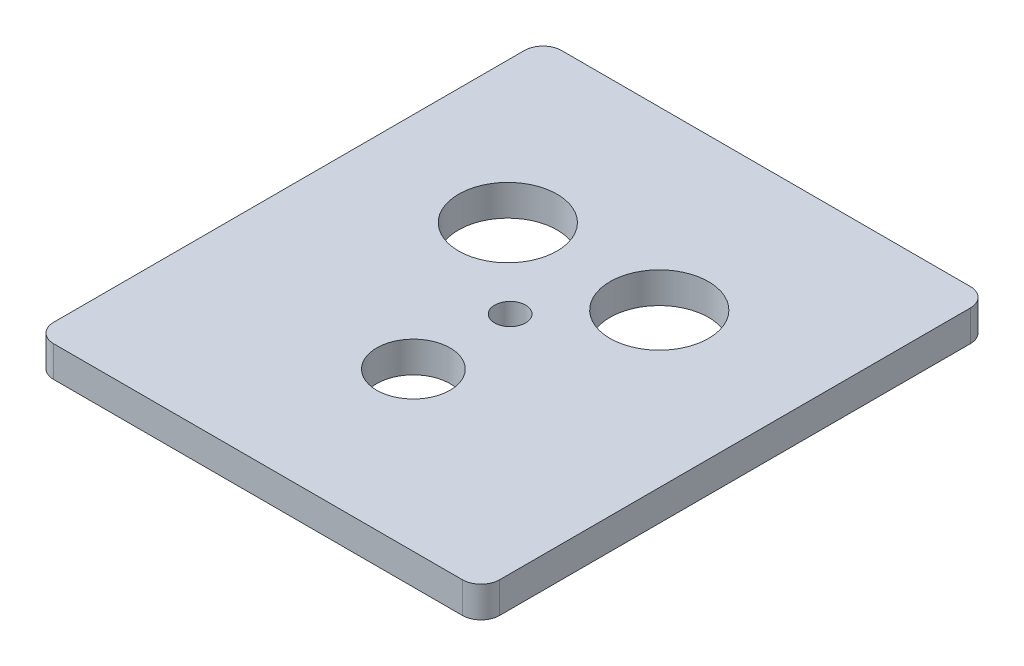
ISO-10303-21;
HEADER;
FILE_DESCRIPTION(('STEP AP214'),'2;1');
FILE_NAME('part.step','',(''),(''),'','','');
FILE_SCHEMA(('AUTOMOTIVE_DESIGN { 1 0 10303 214 1 1 1 1 }'));
ENDSEC;
DATA;
#1=APPLICATION_CONTEXT('core data for automotive mechanical design processes');
#2=APPLICATION_PROTOCOL_DEFINITION('international standard','automotive_design',2000,#1);
#3=PRODUCT_CONTEXT('',#1,'mechanical');
#4=PRODUCT('Part','Part','',(#3));
#5=PRODUCT_RELATED_PRODUCT_CATEGORY('part','',(#4));
#6=PRODUCT_DEFINITION_FORMATION('','',#4);
#7=PRODUCT_DEFINITION_CONTEXT('part definition',#1,'design');
#8=PRODUCT_DEFINITION('design','',#6,#7);
#9=PRODUCT_DEFINITION_SHAPE('','',#8);
#10=(LENGTH_UNIT() NAMED_UNIT(*) SI_UNIT(.MILLI.,.METRE.));
#11=(NAMED_UNIT(*) PLANE_ANGLE_UNIT() SI_UNIT($,.RADIAN.));
#12=(NAMED_UNIT(*) SI_UNIT($,.STERADIAN.) SOLID_ANGLE_UNIT());
#13=UNCERTAINTY_MEASURE_WITH_UNIT(LENGTH_MEASURE(1.E-05),#10,'distance_accuracy_value','');
#14=(GEOMETRIC_REPRESENTATION_CONTEXT(3) GLOBAL_UNCERTAINTY_ASSIGNED_CONTEXT((#13)) GLOBAL_UNIT_ASSIGNED_CONTEXT((#10,
#11,#12)) REPRESENTATION_CONTEXT('',''));
#15=CARTESIAN_POINT('',(0.,0.,0.));
#16=DIRECTION('',(0.,0.,1.));
#17=DIRECTION('',(1.,0.,0.));
#18=AXIS2_PLACEMENT_3D('',#15,#16,#17);
#19=CARTESIAN_POINT('',(-34.7211155378486,5.,50.601593625498));
#20=DIRECTION('',(0.,-1.,0.));
#21=DIRECTION('',(0.,0.,-1.));
#22=AXIS2_PLACEMENT_3D('',#19,#20,#21);
#23=CYLINDRICAL_SURFACE('',#22,3.);
#24=CARTESIAN_POINT('',(-34.7211155378486,0.,50.601593625498));
#25=DIRECTION('',(0.,1.,0.));
#26=DIRECTION('',(0.,0.,1.));
#27=AXIS2_PLACEMENT_3D('',#24,#25,#26);
#28=CIRCLE('',#27,3.);
#29=CARTESIAN_POINT('',(-37.7211155378486,0.,50.601593625498));
#30=VERTEX_POINT('',#29);
#31=CARTESIAN_POINT('',(-34.7211155378486,0.,53.601593625498));
#32=VERTEX_POINT('',#31);
#33=EDGE_CURVE('E135',#30,#32,#28,.T.);
#34=ORIENTED_EDGE('',*,*,#33,.T.);
#35=DIRECTION('',(0.,-1.,0.));
#36=VECTOR('',#35,1.);
#37=CARTESIAN_POINT('',(-34.7211155378486,5.,53.601593625498));
#38=LINE('',#37,#36);
#39=CARTESIAN_POINT('',(-34.7211155378486,5.,53.601593625498));
#40=VERTEX_POINT('',#39);
#41=EDGE_CURVE('E11',#40,#32,#38,.T.);
#42=ORIENTED_EDGE('',*,*,#41,.F.);
#43=CARTESIAN_POINT('',(-34.7211155378486,5.,50.601593625498));
#44=DIRECTION('',(0.,1.,0.));
#45=DIRECTION('',(0.,0.,1.));
#46=AXIS2_PLACEMENT_3D('',#43,#44,#45);
#47=CIRCLE('',#46,3.);
#48=CARTESIAN_POINT('',(-37.7211155378486,5.,50.601593625498));
#49=VERTEX_POINT('',#48);
#50=EDGE_CURVE('E150',#49,#40,#47,.T.);
#51=ORIENTED_EDGE('',*,*,#50,.F.);
#52=DIRECTION('',(0.,-1.,0.));
#53=VECTOR('',#52,1.);
#54=CARTESIAN_POINT('',(-37.7211155378486,5.,50.601593625498));
#55=LINE('',#54,#53);
#56=EDGE_CURVE('E131',#49,#30,#55,.T.);
#57=ORIENTED_EDGE('',*,*,#56,.T.);
#58=EDGE_LOOP('',(#34,#42,#51,#57));
#59=FACE_BOUND('',#58,.T.);
#60=ADVANCED_FACE('F39',(#59),#23,.T.);
#61=CARTESIAN_POINT('',(-34.7211155378486,5.,53.601593625498));
#62=DIRECTION('',(0.,0.,-1.));
#63=DIRECTION('',(-1.,0.,0.));
#64=AXIS2_PLACEMENT_3D('',#61,#62,#63);
#65=PLANE('',#64);
#66=DIRECTION('',(1.,0.,0.));
#67=VECTOR('',#66,1.);
#68=CARTESIAN_POINT('',(-34.7211155378486,0.,53.601593625498));
#69=LINE('',#68,#67);
#70=CARTESIAN_POINT('',(31.2788844621514,0.,53.601593625498));
#71=VERTEX_POINT('',#70);
#72=EDGE_CURVE('E138',#32,#71,#69,.T.);
#73=ORIENTED_EDGE('',*,*,#72,.T.);
#74=DIRECTION('',(0.,-1.,0.));
#75=VECTOR('',#74,1.);
#76=CARTESIAN_POINT('',(31.2788844621514,5.,53.601593625498));
#77=LINE('',#76,#75);
#78=CARTESIAN_POINT('',(31.2788844621514,5.,53.601593625498));
#79=VERTEX_POINT('',#78);
#80=EDGE_CURVE('E47',#79,#71,#77,.T.);
#81=ORIENTED_EDGE('',*,*,#80,.F.);
#82=DIRECTION('',(1.,0.,0.));
#83=VECTOR('',#82,1.);
#84=CARTESIAN_POINT('',(-34.7211155378486,5.,53.601593625498));
#85=LINE('',#84,#83);
#86=EDGE_CURVE('E98',#40,#79,#85,.T.);
#87=ORIENTED_EDGE('',*,*,#86,.F.);
#88=ORIENTED_EDGE('',*,*,#41,.T.);
#89=EDGE_LOOP('',(#73,#81,#87,#88));
#90=FACE_BOUND('',#89,.T.);
#91=ADVANCED_FACE('F240',(#90),#65,.F.);
#92=CARTESIAN_POINT('',(31.2788844621514,5.,50.601593625498));
#93=DIRECTION('',(0.,-1.,0.));
#94=DIRECTION('',(0.,0.,-1.));
#95=AXIS2_PLACEMENT_3D('',#92,#93,#94);
#96=CYLINDRICAL_SURFACE('',#95,3.);
#97=CARTESIAN_POINT('',(31.2788844621514,0.,50.601593625498));
#98=DIRECTION('',(0.,1.,0.));
#99=DIRECTION('',(0.,0.,1.));
#100=AXIS2_PLACEMENT_3D('',#97,#98,#99);
#101=CIRCLE('',#100,3.);
#102=CARTESIAN_POINT('',(34.2788844621514,0.,50.601593625498));
#103=VERTEX_POINT('',#102);
#104=EDGE_CURVE('E141',#71,#103,#101,.T.);
#105=ORIENTED_EDGE('',*,*,#104,.T.);
#106=DIRECTION('',(0.,-1.,0.));
#107=VECTOR('',#106,1.);
#108=CARTESIAN_POINT('',(34.2788844621514,5.,50.601593625498));
#109=LINE('',#108,#107);
#110=CARTESIAN_POINT('',(34.2788844621514,5.,50.601593625498));
#111=VERTEX_POINT('',#110);
#112=EDGE_CURVE('E157',#111,#103,#109,.T.);
#113=ORIENTED_EDGE('',*,*,#112,.F.);
#114=CARTESIAN_POINT('',(31.2788844621514,5.,50.601593625498));
#115=DIRECTION('',(0.,1.,0.));
#116=DIRECTION('',(0.,0.,1.));
#117=AXIS2_PLACEMENT_3D('',#114,#115,#116);
#118=CIRCLE('',#117,3.);
#119=EDGE_CURVE('E165',#79,#111,#118,.T.);
#120=ORIENTED_EDGE('',*,*,#119,.F.);
#121=ORIENTED_EDGE('',*,*,#80,.T.);
#122=EDGE_LOOP('',(#105,#113,#120,#121));
#123=FACE_BOUND('',#122,.T.);
#124=ADVANCED_FACE('F163',(#123),#96,.T.);
#125=CARTESIAN_POINT('',(34.2788844621514,5.,-25.398406374502));
#126=DIRECTION('',(-1.,0.,0.));
#127=DIRECTION('',(0.,0.,1.));
#128=AXIS2_PLACEMENT_3D('',#125,#126,#127);
#129=PLANE('',#128);
#130=DIRECTION('',(0.,0.,-1.));
#131=VECTOR('',#130,1.);
#132=CARTESIAN_POINT('',(34.2788844621514,0.,-25.398406374502));
#133=LINE('',#132,#131);
#134=CARTESIAN_POINT('',(34.2788844621514,0.,-25.398406374502));
#135=VERTEX_POINT('',#134);
#136=EDGE_CURVE('E143',#103,#135,#133,.T.);
#137=ORIENTED_EDGE('',*,*,#136,.T.);
#138=DIRECTION('',(0.,-1.,0.));
#139=VECTOR('',#138,1.);
#140=CARTESIAN_POINT('',(34.2788844621514,5.,-25.398406374502));
#141=LINE('',#140,#139);
#142=CARTESIAN_POINT('',(34.2788844621514,5.,-25.398406374502));
#143=VERTEX_POINT('',#142);
#144=EDGE_CURVE('E154',#143,#135,#141,.T.);
#145=ORIENTED_EDGE('',*,*,#144,.F.);
#146=DIRECTION('',(0.,0.,-1.));
#147=VECTOR('',#146,1.);
#148=CARTESIAN_POINT('',(34.2788844621514,5.,-25.398406374502));
#149=LINE('',#148,#147);
#150=EDGE_CURVE('E177',#111,#143,#149,.T.);
#151=ORIENTED_EDGE('',*,*,#150,.F.);
#152=ORIENTED_EDGE('',*,*,#112,.T.);
#153=EDGE_LOOP('',(#137,#145,#151,#152));
#154=FACE_BOUND('',#153,.T.);
#155=ADVANCED_FACE('F173',(#154),#129,.F.);
#156=CARTESIAN_POINT('',(31.2788844621514,5.,-25.398406374502));
#157=DIRECTION('',(0.,-1.,0.));
#158=DIRECTION('',(0.,0.,-1.));
#159=AXIS2_PLACEMENT_3D('',#156,#157,#158);
#160=CYLINDRICAL_SURFACE('',#159,3.);
#161=CARTESIAN_POINT('',(31.2788844621514,0.,-25.398406374502));
#162=DIRECTION('',(0.,1.,0.));
#163=DIRECTION('',(0.,0.,-1.));
#164=AXIS2_PLACEMENT_3D('',#161,#162,#163);
#165=CIRCLE('',#164,3.);
#166=CARTESIAN_POINT('',(31.2788844621514,0.,-28.398406374502));
#167=VERTEX_POINT('',#166);
#168=EDGE_CURVE('E145',#135,#167,#165,.T.);
#169=ORIENTED_EDGE('',*,*,#168,.T.);
#170=DIRECTION('',(0.,-1.,0.));
#171=VECTOR('',#170,1.);
#172=CARTESIAN_POINT('',(31.2788844621514,5.,-28.398406374502));
#173=LINE('',#172,#171);
#174=CARTESIAN_POINT('',(31.2788844621514,5.,-28.398406374502));
#175=VERTEX_POINT('',#174);
#176=EDGE_CURVE('E126',#175,#167,#173,.T.);
#177=ORIENTED_EDGE('',*,*,#176,.F.);
#178=CARTESIAN_POINT('',(31.2788844621514,5.,-25.398406374502));
#179=DIRECTION('',(0.,1.,0.));
#180=DIRECTION('',(0.,0.,-1.));
#181=AXIS2_PLACEMENT_3D('',#178,#179,#180);
#182=CIRCLE('',#181,3.);
#183=EDGE_CURVE('E117',#143,#175,#182,.T.);
#184=ORIENTED_EDGE('',*,*,#183,.F.);
#185=ORIENTED_EDGE('',*,*,#144,.T.);
#186=EDGE_LOOP('',(#169,#177,#184,#185));
#187=FACE_BOUND('',#186,.T.);
#188=ADVANCED_FACE('F176',(#187),#160,.T.);
#189=CARTESIAN_POINT('',(-34.7211155378486,5.,-28.398406374502));
#190=DIRECTION('',(0.,0.,1.));
#191=DIRECTION('',(1.,0.,0.));
#192=AXIS2_PLACEMENT_3D('',#189,#190,#191);
#193=PLANE('',#192);
#194=DIRECTION('',(-1.,0.,0.));
#195=VECTOR('',#194,1.);
#196=CARTESIAN_POINT('',(-34.7211155378486,0.,-28.398406374502));
#197=LINE('',#196,#195);
#198=CARTESIAN_POINT('',(-34.7211155378486,0.,-28.398406374502));
#199=VERTEX_POINT('',#198);
#200=EDGE_CURVE('E125',#167,#199,#197,.T.);
#201=ORIENTED_EDGE('',*,*,#200,.T.);
#202=DIRECTION('',(0.,-1.,0.));
#203=VECTOR('',#202,1.);
#204=CARTESIAN_POINT('',(-34.7211155378486,5.,-28.398406374502));
#205=LINE('',#204,#203);
#206=CARTESIAN_POINT('',(-34.7211155378486,5.,-28.398406374502));
#207=VERTEX_POINT('',#206);
#208=EDGE_CURVE('E122',#207,#199,#205,.T.);
#209=ORIENTED_EDGE('',*,*,#208,.F.);
#210=DIRECTION('',(-1.,0.,0.));
#211=VECTOR('',#210,1.);
#212=CARTESIAN_POINT('',(-34.7211155378486,5.,-28.398406374502));
#213=LINE('',#212,#211);
#214=EDGE_CURVE('E111',#175,#207,#213,.T.);
#215=ORIENTED_EDGE('',*,*,#214,.F.);
#216=ORIENTED_EDGE('',*,*,#176,.T.);
#217=EDGE_LOOP('',(#201,#209,#215,#216));
#218=FACE_BOUND('',#217,.T.);
#219=ADVANCED_FACE('F123',(#218),#193,.F.);
#220=CARTESIAN_POINT('',(-34.7211155378486,5.,-25.398406374502));
#221=DIRECTION('',(0.,-1.,0.));
#222=DIRECTION('',(0.,0.,-1.));
#223=AXIS2_PLACEMENT_3D('',#220,#221,#222);
#224=CYLINDRICAL_SURFACE('',#223,3.);
#225=CARTESIAN_POINT('',(-34.7211155378486,0.,-25.398406374502));
#226=DIRECTION('',(0.,1.,0.));
#227=DIRECTION('',(0.,0.,1.));
#228=AXIS2_PLACEMENT_3D('',#225,#226,#227);
#229=CIRCLE('',#228,3.);
#230=CARTESIAN_POINT('',(-37.7211155378486,0.,-25.398406374502));
#231=VERTEX_POINT('',#230);
#232=EDGE_CURVE('E84',#199,#231,#229,.T.);
#233=ORIENTED_EDGE('',*,*,#232,.T.);
#234=DIRECTION('',(0.,-1.,0.));
#235=VECTOR('',#234,1.);
#236=CARTESIAN_POINT('',(-37.7211155378486,5.,-25.398406374502));
#237=LINE('',#236,#235);
#238=CARTESIAN_POINT('',(-37.7211155378486,5.,-25.398406374502));
#239=VERTEX_POINT('',#238);
#240=EDGE_CURVE('E127',#239,#231,#237,.T.);
#241=ORIENTED_EDGE('',*,*,#240,.F.);
#242=CARTESIAN_POINT('',(-34.7211155378486,5.,-25.398406374502));
#243=DIRECTION('',(0.,1.,0.));
#244=DIRECTION('',(0.,0.,1.));
#245=AXIS2_PLACEMENT_3D('',#242,#243,#244);
#246=CIRCLE('',#245,3.);
#247=EDGE_CURVE('E115',#207,#239,#246,.T.);
#248=ORIENTED_EDGE('',*,*,#247,.F.);
#249=ORIENTED_EDGE('',*,*,#208,.T.);
#250=EDGE_LOOP('',(#233,#241,#248,#249));
#251=FACE_BOUND('',#250,.T.);
#252=ADVANCED_FACE('F129',(#251),#224,.T.);
#253=CARTESIAN_POINT('',(-37.7211155378486,5.,-25.398406374502));
#254=DIRECTION('',(1.,0.,0.));
#255=DIRECTION('',(0.,0.,-1.));
#256=AXIS2_PLACEMENT_3D('',#253,#254,#255);
#257=PLANE('',#256);
#258=DIRECTION('',(0.,0.,1.));
#259=VECTOR('',#258,1.);
#260=CARTESIAN_POINT('',(-37.7211155378486,0.,-25.398406374502));
#261=LINE('',#260,#259);
#262=EDGE_CURVE('E90',#231,#30,#261,.T.);
#263=ORIENTED_EDGE('',*,*,#262,.T.);
#264=ORIENTED_EDGE('',*,*,#56,.F.);
#265=DIRECTION('',(0.,0.,1.));
#266=VECTOR('',#265,1.);
#267=CARTESIAN_POINT('',(-37.7211155378486,5.,-25.398406374502));
#268=LINE('',#267,#266);
#269=EDGE_CURVE('E55',#239,#49,#268,.T.);
#270=ORIENTED_EDGE('',*,*,#269,.F.);
#271=ORIENTED_EDGE('',*,*,#240,.T.);
#272=EDGE_LOOP('',(#263,#264,#270,#271));
#273=FACE_BOUND('',#272,.T.);
#274=ADVANCED_FACE('F218',(#273),#257,.F.);
#275=CARTESIAN_POINT('',(-34.7211155378486,5.,50.601593625498));
#276=DIRECTION('',(0.,1.,0.));
#277=DIRECTION('',(0.,0.,1.));
#278=AXIS2_PLACEMENT_3D('',#275,#276,#277);
#279=PLANE('',#278);
#280=CARTESIAN_POINT('',(-2.0245946948044,5.,12.601593625498));
#281=DIRECTION('',(0.,1.,0.));
#282=DIRECTION('',(0.,0.,1.));
#283=AXIS2_PLACEMENT_3D('',#280,#281,#282);
#284=CIRCLE('',#283,2.5);
#285=CARTESIAN_POINT('',(-2.0245946948044,5.,15.101593625498));
#286=VERTEX_POINT('',#285);
#287=EDGE_CURVE('E201',#286,#286,#284,.T.);
#288=ORIENTED_EDGE('',*,*,#287,.F.);
#289=EDGE_LOOP('',(#288));
#290=FACE_BOUND('',#289,.T.);
#291=CARTESIAN_POINT('',(-2.13935624666508,5.,28.1058663850717));
#292=DIRECTION('',(0.,1.,0.));
#293=DIRECTION('',(0.,0.,1.));
#294=AXIS2_PLACEMENT_3D('',#291,#292,#293);
#295=CIRCLE('',#294,5.925);
#296=CARTESIAN_POINT('',(-2.13935624666508,5.,34.0308663850717));
#297=VERTEX_POINT('',#296);
#298=EDGE_CURVE('E195',#297,#297,#295,.T.);
#299=ORIENTED_EDGE('',*,*,#298,.F.);
#300=EDGE_LOOP('',(#299));
#301=FACE_BOUND('',#300,.T.);
#302=CARTESIAN_POINT('',(9.45346273587086,5.,0.));
#303=DIRECTION('',(0.,1.,0.));
#304=DIRECTION('',(0.,0.,1.));
#305=AXIS2_PLACEMENT_3D('',#302,#303,#304);
#306=CIRCLE('',#305,7.95);
#307=CARTESIAN_POINT('',(9.45346273587086,5.,7.95));
#308=VERTEX_POINT('',#307);
#309=EDGE_CURVE('E190',#308,#308,#306,.T.);
#310=ORIENTED_EDGE('',*,*,#309,.F.);
#311=EDGE_LOOP('',(#310));
#312=FACE_BOUND('',#311,.T.);
#313=CARTESIAN_POINT('',(-14.9965372641291,5.,0.));
#314=DIRECTION('',(0.,1.,0.));
#315=DIRECTION('',(0.,0.,1.));
#316=AXIS2_PLACEMENT_3D('',#313,#314,#315);
#317=CIRCLE('',#316,7.95);
#318=CARTESIAN_POINT('',(-14.9965372641291,5.,7.95));
#319=VERTEX_POINT('',#318);
#320=EDGE_CURVE('E183',#319,#319,#317,.T.);
#321=ORIENTED_EDGE('',*,*,#320,.F.);
#322=EDGE_LOOP('',(#321));
#323=FACE_BOUND('',#322,.T.);
#324=ORIENTED_EDGE('',*,*,#50,.T.);
#325=ORIENTED_EDGE('',*,*,#86,.T.);
#326=ORIENTED_EDGE('',*,*,#119,.T.);
#327=ORIENTED_EDGE('',*,*,#150,.T.);
#328=ORIENTED_EDGE('',*,*,#183,.T.);
#329=ORIENTED_EDGE('',*,*,#214,.T.);
#330=ORIENTED_EDGE('',*,*,#247,.T.);
#331=ORIENTED_EDGE('',*,*,#269,.T.);
#332=EDGE_LOOP('',(#324,#325,#326,#327,#328,#329,#330,#331));
#333=FACE_BOUND('',#332,.T.);
#334=ADVANCED_FACE('F113',(#290,#301,#312,#323,#333),#279,.T.);
#335=CARTESIAN_POINT('',(-34.7211155378486,0.,50.601593625498));
#336=DIRECTION('',(0.,1.,0.));
#337=DIRECTION('',(0.,0.,1.));
#338=AXIS2_PLACEMENT_3D('',#335,#336,#337);
#339=PLANE('',#338);
#340=CARTESIAN_POINT('',(-2.0245946948044,0.,12.601593625498));
#341=DIRECTION('',(0.,1.,0.));
#342=DIRECTION('',(0.,0.,1.));
#343=AXIS2_PLACEMENT_3D('',#340,#341,#342);
#344=CIRCLE('',#343,2.5);
#345=CARTESIAN_POINT('',(-2.0245946948044,0.,15.101593625498));
#346=VERTEX_POINT('',#345);
#347=EDGE_CURVE('E187',#346,#346,#344,.T.);
#348=ORIENTED_EDGE('',*,*,#347,.T.);
#349=EDGE_LOOP('',(#348));
#350=FACE_BOUND('',#349,.T.);
#351=CARTESIAN_POINT('',(-2.13935624666508,0.,28.1058663850717));
#352=DIRECTION('',(0.,1.,0.));
#353=DIRECTION('',(0.,0.,1.));
#354=AXIS2_PLACEMENT_3D('',#351,#352,#353);
#355=CIRCLE('',#354,5.925);
#356=CARTESIAN_POINT('',(-2.13935624666508,0.,34.0308663850717));
#357=VERTEX_POINT('',#356);
#358=EDGE_CURVE('E198',#357,#357,#355,.T.);
#359=ORIENTED_EDGE('',*,*,#358,.T.);
#360=EDGE_LOOP('',(#359));
#361=FACE_BOUND('',#360,.T.);
#362=CARTESIAN_POINT('',(9.45346273587086,0.,0.));
#363=DIRECTION('',(0.,1.,0.));
#364=DIRECTION('',(0.,0.,1.));
#365=AXIS2_PLACEMENT_3D('',#362,#363,#364);
#366=CIRCLE('',#365,7.95);
#367=CARTESIAN_POINT('',(9.45346273587086,0.,7.95));
#368=VERTEX_POINT('',#367);
#369=EDGE_CURVE('E139',#368,#368,#366,.T.);
#370=ORIENTED_EDGE('',*,*,#369,.T.);
#371=EDGE_LOOP('',(#370));
#372=FACE_BOUND('',#371,.T.);
#373=CARTESIAN_POINT('',(-14.9965372641291,0.,0.));
#374=DIRECTION('',(0.,1.,0.));
#375=DIRECTION('',(0.,0.,1.));
#376=AXIS2_PLACEMENT_3D('',#373,#374,#375);
#377=CIRCLE('',#376,7.95);
#378=CARTESIAN_POINT('',(-14.9965372641291,0.,7.95));
#379=VERTEX_POINT('',#378);
#380=EDGE_CURVE('E186',#379,#379,#377,.T.);
#381=ORIENTED_EDGE('',*,*,#380,.T.);
#382=EDGE_LOOP('',(#381));
#383=FACE_BOUND('',#382,.T.);
#384=ORIENTED_EDGE('',*,*,#33,.F.);
#385=ORIENTED_EDGE('',*,*,#262,.F.);
#386=ORIENTED_EDGE('',*,*,#232,.F.);
#387=ORIENTED_EDGE('',*,*,#200,.F.);
#388=ORIENTED_EDGE('',*,*,#168,.F.);
#389=ORIENTED_EDGE('',*,*,#136,.F.);
#390=ORIENTED_EDGE('',*,*,#104,.F.);
#391=ORIENTED_EDGE('',*,*,#72,.F.);
#392=EDGE_LOOP('',(#384,#385,#386,#387,#388,#389,#390,#391));
#393=FACE_BOUND('',#392,.T.);
#394=ADVANCED_FACE('F169',(#350,#361,#372,#383,#393),#339,.F.);
#395=CARTESIAN_POINT('',(-14.9965372641291,0.,0.));
#396=DIRECTION('',(0.,1.,0.));
#397=DIRECTION('',(0.,0.,1.));
#398=AXIS2_PLACEMENT_3D('',#395,#396,#397);
#399=CYLINDRICAL_SURFACE('',#398,7.95);
#400=ORIENTED_EDGE('',*,*,#380,.F.);
#401=EDGE_LOOP('',(#400));
#402=FACE_BOUND('',#401,.T.);
#403=ORIENTED_EDGE('',*,*,#320,.T.);
#404=EDGE_LOOP('',(#403));
#405=FACE_BOUND('',#404,.T.);
#406=ADVANCED_FACE('F226',(#402,#405),#399,.F.);
#407=CARTESIAN_POINT('',(9.45346273587086,0.,0.));
#408=DIRECTION('',(0.,1.,0.));
#409=DIRECTION('',(0.,0.,1.));
#410=AXIS2_PLACEMENT_3D('',#407,#408,#409);
#411=CYLINDRICAL_SURFACE('',#410,7.95);
#412=ORIENTED_EDGE('',*,*,#369,.F.);
#413=EDGE_LOOP('',(#412));
#414=FACE_BOUND('',#413,.T.);
#415=ORIENTED_EDGE('',*,*,#309,.T.);
#416=EDGE_LOOP('',(#415));
#417=FACE_BOUND('',#416,.T.);
#418=ADVANCED_FACE('F228',(#414,#417),#411,.F.);
#419=CARTESIAN_POINT('',(-2.13935624666508,0.,28.1058663850717));
#420=DIRECTION('',(0.,1.,0.));
#421=DIRECTION('',(0.,0.,1.));
#422=AXIS2_PLACEMENT_3D('',#419,#420,#421);
#423=CYLINDRICAL_SURFACE('',#422,5.925);
#424=ORIENTED_EDGE('',*,*,#358,.F.);
#425=EDGE_LOOP('',(#424));
#426=FACE_BOUND('',#425,.T.);
#427=ORIENTED_EDGE('',*,*,#298,.T.);
#428=EDGE_LOOP('',(#427));
#429=FACE_BOUND('',#428,.T.);
#430=ADVANCED_FACE('F212',(#426,#429),#423,.F.);
#431=CARTESIAN_POINT('',(-2.0245946948044,0.,12.601593625498));
#432=DIRECTION('',(0.,1.,0.));
#433=DIRECTION('',(0.,0.,1.));
#434=AXIS2_PLACEMENT_3D('',#431,#432,#433);
#435=CYLINDRICAL_SURFACE('',#434,2.5);
#436=ORIENTED_EDGE('',*,*,#347,.F.);
#437=EDGE_LOOP('',(#436));
#438=FACE_BOUND('',#437,.T.);
#439=ORIENTED_EDGE('',*,*,#287,.T.);
#440=EDGE_LOOP('',(#439));
#441=FACE_BOUND('',#440,.T.);
#442=ADVANCED_FACE('F209',(#438,#441),#435,.F.);
#443=CLOSED_SHELL('',(#60,#91,#124,#155,#188,#219,#252,#274,#334,#394,#406,#418,#430,#442));
#444=MANIFOLD_SOLID_BREP('B2',#443);
#445=ADVANCED_BREP_SHAPE_REPRESENTATION('',(#18,#444),#14);
#446=SHAPE_DEFINITION_REPRESENTATION(#9,#445);
ENDSEC;
END-ISO-10303-21;
